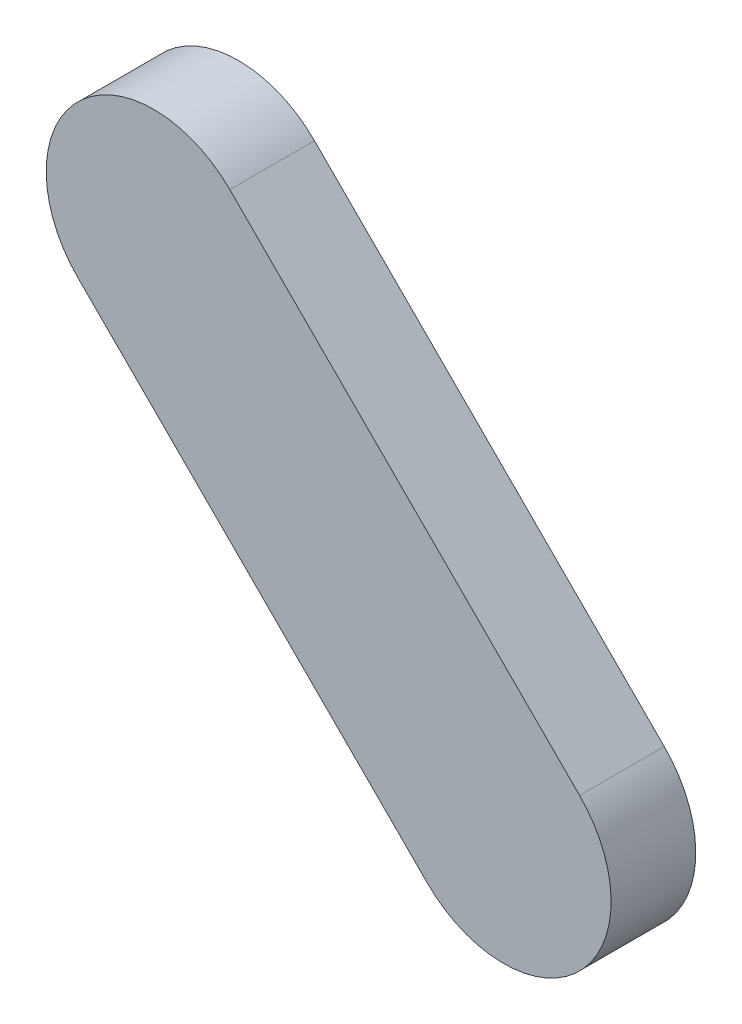
ISO-10303-21;
HEADER;
FILE_DESCRIPTION(('STEP AP214'),'2;1');
FILE_NAME('part.step','',(''),(''),'','','');
FILE_SCHEMA(('AUTOMOTIVE_DESIGN { 1 0 10303 214 1 1 1 1 }'));
ENDSEC;
DATA;
#1=APPLICATION_CONTEXT('core data for automotive mechanical design processes');
#2=APPLICATION_PROTOCOL_DEFINITION('international standard','automotive_design',2000,#1);
#3=PRODUCT_CONTEXT('',#1,'mechanical');
#4=PRODUCT('Part','Part','',(#3));
#5=PRODUCT_RELATED_PRODUCT_CATEGORY('part','',(#4));
#6=PRODUCT_DEFINITION_FORMATION('','',#4);
#7=PRODUCT_DEFINITION_CONTEXT('part definition',#1,'design');
#8=PRODUCT_DEFINITION('design','',#6,#7);
#9=PRODUCT_DEFINITION_SHAPE('','',#8);
#10=(LENGTH_UNIT() NAMED_UNIT(*) SI_UNIT(.MILLI.,.METRE.));
#11=(NAMED_UNIT(*) PLANE_ANGLE_UNIT() SI_UNIT($,.RADIAN.));
#12=(NAMED_UNIT(*) SI_UNIT($,.STERADIAN.) SOLID_ANGLE_UNIT());
#13=UNCERTAINTY_MEASURE_WITH_UNIT(LENGTH_MEASURE(1.E-05),#10,'distance_accuracy_value','');
#14=(GEOMETRIC_REPRESENTATION_CONTEXT(3) GLOBAL_UNCERTAINTY_ASSIGNED_CONTEXT((#13)) GLOBAL_UNIT_ASSIGNED_CONTEXT((#10,
#11,#12)) REPRESENTATION_CONTEXT('',''));
#15=CARTESIAN_POINT('',(0.,0.,0.));
#16=DIRECTION('',(0.,0.,1.));
#17=DIRECTION('',(1.,0.,0.));
#18=AXIS2_PLACEMENT_3D('',#15,#16,#17);
#19=CARTESIAN_POINT('',(151.1911378,76.46545286,0.));
#20=DIRECTION('',(0.70710678118656,0.707106781186535,0.));
#21=DIRECTION('',(0.707106781186535,-0.70710678118656,0.));
#22=AXIS2_PLACEMENT_3D('',#19,#20,#21);
#23=PLANE('',#22);
#24=DIRECTION('',(0.707106781186535,-0.70710678118656,0.));
#25=VECTOR('',#24,1.);
#26=CARTESIAN_POINT('',(151.1911378,76.46545286,0.1999996));
#27=LINE('',#26,#25);
#28=CARTESIAN_POINT('',(151.1911378,76.46545286,0.1999996));
#29=VERTEX_POINT('',#28);
#30=CARTESIAN_POINT('',(152.01719406,75.6393966,0.1999996));
#31=VERTEX_POINT('',#30);
#32=EDGE_CURVE('E11',#29,#31,#27,.T.);
#33=ORIENTED_EDGE('',*,*,#32,.F.);
#34=DIRECTION('',(0.,0.,1.));
#35=VECTOR('',#34,1.);
#36=CARTESIAN_POINT('',(151.1911378,76.46545286,0.));
#37=LINE('',#36,#35);
#38=CARTESIAN_POINT('',(151.1911378,76.46545286,0.));
#39=VERTEX_POINT('',#38);
#40=EDGE_CURVE('E24',#39,#29,#37,.T.);
#41=ORIENTED_EDGE('',*,*,#40,.F.);
#42=DIRECTION('',(0.707106781186535,-0.70710678118656,0.));
#43=VECTOR('',#42,1.);
#44=CARTESIAN_POINT('',(151.1911378,76.46545286,0.));
#45=LINE('',#44,#43);
#46=CARTESIAN_POINT('',(152.01719406,75.6393966,0.));
#47=VERTEX_POINT('',#46);
#48=EDGE_CURVE('E75',#39,#47,#45,.T.);
#49=ORIENTED_EDGE('',*,*,#48,.T.);
#50=DIRECTION('',(0.,0.,1.));
#51=VECTOR('',#50,1.);
#52=CARTESIAN_POINT('',(152.01719406,75.6393966,0.));
#53=LINE('',#52,#51);
#54=EDGE_CURVE('E37',#47,#31,#53,.T.);
#55=ORIENTED_EDGE('',*,*,#54,.T.);
#56=EDGE_LOOP('',(#33,#41,#49,#55));
#57=FACE_BOUND('',#56,.T.);
#58=ADVANCED_FACE('F17',(#57),#23,.F.);
#59=CARTESIAN_POINT('',(152.19679873,75.81900127,0.));
#60=DIRECTION('',(0.,0.,-1.));
#61=DIRECTION('',(-0.707106781186548,-0.707106781186548,0.));
#62=AXIS2_PLACEMENT_3D('',#59,#60,#61);
#63=CYLINDRICAL_SURFACE('',#62,0.253999360179546);
#64=CARTESIAN_POINT('',(152.19679873,75.81900127,0.1999996));
#65=DIRECTION('',(0.,0.,1.));
#66=DIRECTION('',(-0.707106781186548,-0.707106781186548,0.));
#67=AXIS2_PLACEMENT_3D('',#64,#65,#66);
#68=CIRCLE('',#67,0.253999360179546);
#69=CARTESIAN_POINT('',(152.3764034,75.99860594,0.1999996));
#70=VERTEX_POINT('',#69);
#71=EDGE_CURVE('E83',#31,#70,#68,.T.);
#72=ORIENTED_EDGE('',*,*,#71,.F.);
#73=ORIENTED_EDGE('',*,*,#54,.F.);
#74=CARTESIAN_POINT('',(152.19679873,75.81900127,0.));
#75=DIRECTION('',(0.,0.,1.));
#76=DIRECTION('',(-0.707106781186548,-0.707106781186548,0.));
#77=AXIS2_PLACEMENT_3D('',#74,#75,#76);
#78=CIRCLE('',#77,0.253999360179546);
#79=CARTESIAN_POINT('',(152.3764034,75.99860594,0.));
#80=VERTEX_POINT('',#79);
#81=EDGE_CURVE('E81',#47,#80,#78,.T.);
#82=ORIENTED_EDGE('',*,*,#81,.T.);
#83=DIRECTION('',(0.,0.,1.));
#84=VECTOR('',#83,1.);
#85=CARTESIAN_POINT('',(152.3764034,75.99860594,0.));
#86=LINE('',#85,#84);
#87=EDGE_CURVE('E67',#80,#70,#86,.T.);
#88=ORIENTED_EDGE('',*,*,#87,.T.);
#89=EDGE_LOOP('',(#72,#73,#82,#88));
#90=FACE_BOUND('',#89,.T.);
#91=ADVANCED_FACE('F89',(#90),#63,.T.);
#92=CARTESIAN_POINT('',(152.3764034,75.99860594,0.));
#93=DIRECTION('',(-0.707106781186548,-0.707106781186548,0.));
#94=DIRECTION('',(-0.707106781186548,0.707106781186548,0.));
#95=AXIS2_PLACEMENT_3D('',#92,#93,#94);
#96=PLANE('',#95);
#97=DIRECTION('',(-0.707106781186548,0.707106781186548,0.));
#98=VECTOR('',#97,1.);
#99=CARTESIAN_POINT('',(152.3764034,75.99860594,0.1999996));
#100=LINE('',#99,#98);
#101=CARTESIAN_POINT('',(151.55034714,76.8246622,0.1999996));
#102=VERTEX_POINT('',#101);
#103=EDGE_CURVE('E71',#70,#102,#100,.T.);
#104=ORIENTED_EDGE('',*,*,#103,.F.);
#105=ORIENTED_EDGE('',*,*,#87,.F.);
#106=DIRECTION('',(-0.707106781186548,0.707106781186548,0.));
#107=VECTOR('',#106,1.);
#108=CARTESIAN_POINT('',(152.3764034,75.99860594,0.));
#109=LINE('',#108,#107);
#110=CARTESIAN_POINT('',(151.55034714,76.8246622,0.));
#111=VERTEX_POINT('',#110);
#112=EDGE_CURVE('E63',#80,#111,#109,.T.);
#113=ORIENTED_EDGE('',*,*,#112,.T.);
#114=DIRECTION('',(0.,0.,1.));
#115=VECTOR('',#114,1.);
#116=CARTESIAN_POINT('',(151.55034714,76.8246622,0.));
#117=LINE('',#116,#115);
#118=EDGE_CURVE('E53',#111,#102,#117,.T.);
#119=ORIENTED_EDGE('',*,*,#118,.T.);
#120=EDGE_LOOP('',(#104,#105,#113,#119));
#121=FACE_BOUND('',#120,.T.);
#122=ADVANCED_FACE('F66',(#121),#96,.F.);
#123=CARTESIAN_POINT('',(151.37074247,76.64505753,0.));
#124=DIRECTION('',(0.,0.,-1.));
#125=DIRECTION('',(0.707106781186576,0.70710678118652,0.));
#126=AXIS2_PLACEMENT_3D('',#123,#124,#125);
#127=CYLINDRICAL_SURFACE('',#126,0.253999360179529);
#128=CARTESIAN_POINT('',(151.37074247,76.64505753,0.1999996));
#129=DIRECTION('',(0.,0.,1.));
#130=DIRECTION('',(0.707106781186576,0.70710678118652,0.));
#131=AXIS2_PLACEMENT_3D('',#128,#129,#130);
#132=CIRCLE('',#131,0.253999360179529);
#133=EDGE_CURVE('E59',#102,#29,#132,.T.);
#134=ORIENTED_EDGE('',*,*,#133,.F.);
#135=ORIENTED_EDGE('',*,*,#118,.F.);
#136=CARTESIAN_POINT('',(151.37074247,76.64505753,0.));
#137=DIRECTION('',(0.,0.,1.));
#138=DIRECTION('',(0.707106781186576,0.70710678118652,0.));
#139=AXIS2_PLACEMENT_3D('',#136,#137,#138);
#140=CIRCLE('',#139,0.253999360179529);
#141=EDGE_CURVE('E57',#111,#39,#140,.T.);
#142=ORIENTED_EDGE('',*,*,#141,.T.);
#143=ORIENTED_EDGE('',*,*,#40,.T.);
#144=EDGE_LOOP('',(#134,#135,#142,#143));
#145=FACE_BOUND('',#144,.T.);
#146=ADVANCED_FACE('F55',(#145),#127,.T.);
#147=CARTESIAN_POINT('',(151.1911378,76.46545286,0.));
#148=DIRECTION('',(0.,0.,-1.));
#149=DIRECTION('',(-1.,0.,0.));
#150=AXIS2_PLACEMENT_3D('',#147,#148,#149);
#151=PLANE('',#150);
#152=ORIENTED_EDGE('',*,*,#141,.F.);
#153=ORIENTED_EDGE('',*,*,#112,.F.);
#154=ORIENTED_EDGE('',*,*,#81,.F.);
#155=ORIENTED_EDGE('',*,*,#48,.F.);
#156=EDGE_LOOP('',(#152,#153,#154,#155));
#157=FACE_BOUND('',#156,.T.);
#158=ADVANCED_FACE('F74',(#157),#151,.T.);
#159=CARTESIAN_POINT('',(151.1911378,76.46545286,0.1999996));
#160=DIRECTION('',(0.,0.,-1.));
#161=DIRECTION('',(-1.,0.,0.));
#162=AXIS2_PLACEMENT_3D('',#159,#160,#161);
#163=PLANE('',#162);
#164=ORIENTED_EDGE('',*,*,#32,.T.);
#165=ORIENTED_EDGE('',*,*,#71,.T.);
#166=ORIENTED_EDGE('',*,*,#103,.T.);
#167=ORIENTED_EDGE('',*,*,#133,.T.);
#168=EDGE_LOOP('',(#164,#165,#166,#167));
#169=FACE_BOUND('',#168,.T.);
#170=ADVANCED_FACE('F91',(#169),#163,.F.);
#171=CLOSED_SHELL('',(#58,#91,#122,#146,#158,#170));
#172=MANIFOLD_SOLID_BREP('B1',#171);
#173=ADVANCED_BREP_SHAPE_REPRESENTATION('',(#18,#172),#14);
#174=SHAPE_DEFINITION_REPRESENTATION(#9,#173);
ENDSEC;
END-ISO-10303-21;
